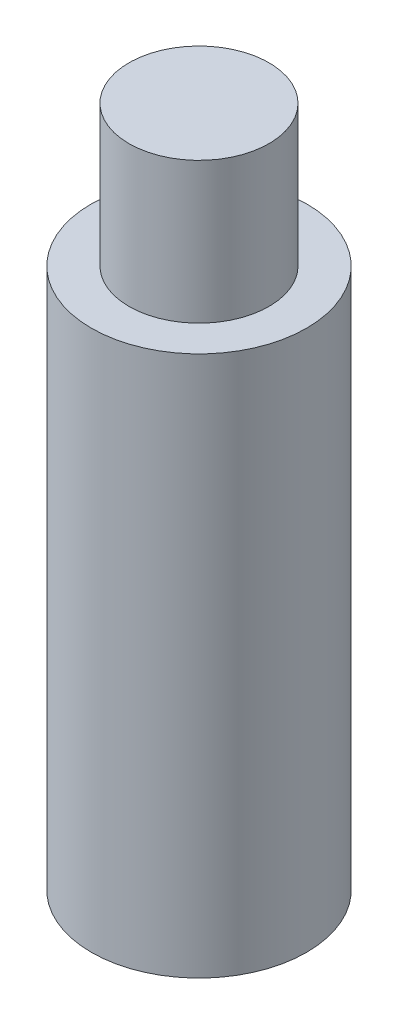
ISO-10303-21;
HEADER;
FILE_DESCRIPTION(('STEP AP214'),'2;1');
FILE_NAME('part.step','',(''),(''),'','','');
FILE_SCHEMA(('AUTOMOTIVE_DESIGN { 1 0 10303 214 1 1 1 1 }'));
ENDSEC;
DATA;
#1=APPLICATION_CONTEXT('core data for automotive mechanical design processes');
#2=APPLICATION_PROTOCOL_DEFINITION('international standard','automotive_design',2000,#1);
#3=PRODUCT_CONTEXT('',#1,'mechanical');
#4=PRODUCT('Part','Part','',(#3));
#5=PRODUCT_RELATED_PRODUCT_CATEGORY('part','',(#4));
#6=PRODUCT_DEFINITION_FORMATION('','',#4);
#7=PRODUCT_DEFINITION_CONTEXT('part definition',#1,'design');
#8=PRODUCT_DEFINITION('design','',#6,#7);
#9=PRODUCT_DEFINITION_SHAPE('','',#8);
#10=(LENGTH_UNIT() NAMED_UNIT(*) SI_UNIT(.MILLI.,.METRE.));
#11=(NAMED_UNIT(*) PLANE_ANGLE_UNIT() SI_UNIT($,.RADIAN.));
#12=(NAMED_UNIT(*) SI_UNIT($,.STERADIAN.) SOLID_ANGLE_UNIT());
#13=UNCERTAINTY_MEASURE_WITH_UNIT(LENGTH_MEASURE(1.E-05),#10,'distance_accuracy_value','');
#14=(GEOMETRIC_REPRESENTATION_CONTEXT(3) GLOBAL_UNCERTAINTY_ASSIGNED_CONTEXT((#13)) GLOBAL_UNIT_ASSIGNED_CONTEXT((#10,
#11,#12)) REPRESENTATION_CONTEXT('',''));
#15=CARTESIAN_POINT('',(0.,0.,0.));
#16=DIRECTION('',(0.,0.,1.));
#17=DIRECTION('',(1.,0.,0.));
#18=AXIS2_PLACEMENT_3D('',#15,#16,#17);
#19=CARTESIAN_POINT('',(0.,0.,0.));
#20=DIRECTION('',(0.,1.,0.));
#21=DIRECTION('',(0.,0.,1.));
#22=AXIS2_PLACEMENT_3D('',#19,#20,#21);
#23=PLANE('',#22);
#24=CARTESIAN_POINT('',(0.,0.,0.));
#25=DIRECTION('',(0.,1.,0.));
#26=DIRECTION('',(0.,0.,1.));
#27=AXIS2_PLACEMENT_3D('',#24,#25,#26);
#28=CIRCLE('',#27,11.45);
#29=CARTESIAN_POINT('',(0.,0.,11.45));
#30=VERTEX_POINT('',#29);
#31=EDGE_CURVE('E44',#30,#30,#28,.T.);
#32=ORIENTED_EDGE('',*,*,#31,.F.);
#33=EDGE_LOOP('',(#32));
#34=FACE_BOUND('',#33,.T.);
#35=DIRECTION('',(0.949325468520331,0.,0.314294694226064));
#36=VECTOR('',#35,1.);
#37=CARTESIAN_POINT('',(-0.963941109857239,0.,2.91157904524799));
#38=LINE('',#37,#36);
#39=CARTESIAN_POINT('',(-3.47490697409351,0.,2.08026957902005));
#40=VERTEX_POINT('',#39);
#41=CARTESIAN_POINT('',(1.54702475437904,0.,3.74288851147593));
#42=VERTEX_POINT('',#41);
#43=EDGE_CURVE('E57',#40,#42,#38,.T.);
#44=ORIENTED_EDGE('',*,*,#43,.T.);
#45=CARTESIAN_POINT('',(0.,0.,0.));
#46=DIRECTION('',(0.,-1.,0.));
#47=DIRECTION('',(0.,0.,-1.));
#48=AXIS2_PLACEMENT_3D('',#45,#46,#47);
#49=CIRCLE('',#48,4.05);
#50=EDGE_CURVE('E77',#40,#42,#49,.T.);
#51=ORIENTED_EDGE('',*,*,#50,.F.);
#52=EDGE_LOOP('',(#44,#51));
#53=FACE_BOUND('',#52,.T.);
#54=ADVANCED_FACE('F40',(#34,#53),#23,.F.);
#55=CARTESIAN_POINT('',(0.,57.5,0.));
#56=DIRECTION('',(0.,-1.,0.));
#57=DIRECTION('',(0.,0.,-1.));
#58=AXIS2_PLACEMENT_3D('',#55,#56,#57);
#59=CYLINDRICAL_SURFACE('',#58,11.45);
#60=CARTESIAN_POINT('',(0.,57.5,0.));
#61=DIRECTION('',(0.,1.,0.));
#62=DIRECTION('',(0.,0.,1.));
#63=AXIS2_PLACEMENT_3D('',#60,#61,#62);
#64=CIRCLE('',#63,11.45);
#65=CARTESIAN_POINT('',(0.,57.5,11.45));
#66=VERTEX_POINT('',#65);
#67=EDGE_CURVE('E49',#66,#66,#64,.T.);
#68=ORIENTED_EDGE('',*,*,#67,.F.);
#69=EDGE_LOOP('',(#68));
#70=FACE_BOUND('',#69,.T.);
#71=ORIENTED_EDGE('',*,*,#31,.T.);
#72=EDGE_LOOP('',(#71));
#73=FACE_BOUND('',#72,.T.);
#74=ADVANCED_FACE('F42',(#70,#73),#59,.T.);
#75=CARTESIAN_POINT('',(0.,57.5,0.));
#76=DIRECTION('',(0.,1.,0.));
#77=DIRECTION('',(0.,0.,1.));
#78=AXIS2_PLACEMENT_3D('',#75,#76,#77);
#79=PLANE('',#78);
#80=CARTESIAN_POINT('',(0.,57.5,0.));
#81=DIRECTION('',(0.,1.,0.));
#82=DIRECTION('',(0.,0.,1.));
#83=AXIS2_PLACEMENT_3D('',#80,#81,#82);
#84=CIRCLE('',#83,7.45);
#85=CARTESIAN_POINT('',(0.,57.5,7.45));
#86=VERTEX_POINT('',#85);
#87=EDGE_CURVE('E11',#86,#86,#84,.T.);
#88=ORIENTED_EDGE('',*,*,#87,.F.);
#89=EDGE_LOOP('',(#88));
#90=FACE_BOUND('',#89,.T.);
#91=ORIENTED_EDGE('',*,*,#67,.T.);
#92=EDGE_LOOP('',(#91));
#93=FACE_BOUND('',#92,.T.);
#94=ADVANCED_FACE('F101',(#90,#93),#79,.T.);
#95=CARTESIAN_POINT('',(0.,72.5,0.));
#96=DIRECTION('',(0.,-1.,0.));
#97=DIRECTION('',(0.,0.,-1.));
#98=AXIS2_PLACEMENT_3D('',#95,#96,#97);
#99=CYLINDRICAL_SURFACE('',#98,7.45);
#100=CARTESIAN_POINT('',(0.,72.5,0.));
#101=DIRECTION('',(0.,1.,0.));
#102=DIRECTION('',(0.,0.,1.));
#103=AXIS2_PLACEMENT_3D('',#100,#101,#102);
#104=CIRCLE('',#103,7.45);
#105=CARTESIAN_POINT('',(0.,72.5,7.45));
#106=VERTEX_POINT('',#105);
#107=EDGE_CURVE('E73',#106,#106,#104,.T.);
#108=ORIENTED_EDGE('',*,*,#107,.F.);
#109=EDGE_LOOP('',(#108));
#110=FACE_BOUND('',#109,.T.);
#111=ORIENTED_EDGE('',*,*,#87,.T.);
#112=EDGE_LOOP('',(#111));
#113=FACE_BOUND('',#112,.T.);
#114=ADVANCED_FACE('F106',(#110,#113),#99,.T.);
#115=CARTESIAN_POINT('',(0.,72.5,0.));
#116=DIRECTION('',(0.,1.,0.));
#117=DIRECTION('',(0.,0.,1.));
#118=AXIS2_PLACEMENT_3D('',#115,#116,#117);
#119=PLANE('',#118);
#120=ORIENTED_EDGE('',*,*,#107,.T.);
#121=EDGE_LOOP('',(#120));
#122=FACE_BOUND('',#121,.T.);
#123=ADVANCED_FACE('F110',(#122),#119,.T.);
#124=CARTESIAN_POINT('',(-0.963941109857239,15.,2.91157904524799));
#125=DIRECTION('',(0.314294694226064,0.,-0.949325468520331));
#126=DIRECTION('',(-0.949325468520331,0.,-0.314294694226064));
#127=AXIS2_PLACEMENT_3D('',#124,#125,#126);
#128=PLANE('',#127);
#129=ORIENTED_EDGE('',*,*,#43,.F.);
#130=DIRECTION('',(0.,-1.,0.));
#131=VECTOR('',#130,1.);
#132=CARTESIAN_POINT('',(-3.47490697409351,15.,2.08026957902005));
#133=LINE('',#132,#131);
#134=CARTESIAN_POINT('',(-3.47490697409351,15.,2.08026957902005));
#135=VERTEX_POINT('',#134);
#136=EDGE_CURVE('E74',#135,#40,#133,.T.);
#137=ORIENTED_EDGE('',*,*,#136,.F.);
#138=DIRECTION('',(0.949325468520331,0.,0.314294694226064));
#139=VECTOR('',#138,1.);
#140=CARTESIAN_POINT('',(-0.963941109857239,15.,2.91157904524799));
#141=LINE('',#140,#139);
#142=CARTESIAN_POINT('',(1.54702475437904,15.,3.74288851147593));
#143=VERTEX_POINT('',#142);
#144=EDGE_CURVE('E63',#135,#143,#141,.T.);
#145=ORIENTED_EDGE('',*,*,#144,.T.);
#146=DIRECTION('',(0.,-1.,0.));
#147=VECTOR('',#146,1.);
#148=CARTESIAN_POINT('',(1.54702475437904,15.,3.74288851147593));
#149=LINE('',#148,#147);
#150=EDGE_CURVE('E67',#143,#42,#149,.T.);
#151=ORIENTED_EDGE('',*,*,#150,.T.);
#152=EDGE_LOOP('',(#129,#137,#145,#151));
#153=FACE_BOUND('',#152,.T.);
#154=ADVANCED_FACE('F69',(#153),#128,.T.);
#155=CARTESIAN_POINT('',(0.,15.,0.));
#156=DIRECTION('',(0.,-1.,0.));
#157=DIRECTION('',(0.,0.,-1.));
#158=AXIS2_PLACEMENT_3D('',#155,#156,#157);
#159=CYLINDRICAL_SURFACE('',#158,4.05);
#160=ORIENTED_EDGE('',*,*,#50,.T.);
#161=ORIENTED_EDGE('',*,*,#150,.F.);
#162=CARTESIAN_POINT('',(0.,15.,0.));
#163=DIRECTION('',(0.,-1.,0.));
#164=DIRECTION('',(0.,0.,-1.));
#165=AXIS2_PLACEMENT_3D('',#162,#163,#164);
#166=CIRCLE('',#165,4.05);
#167=EDGE_CURVE('E83',#135,#143,#166,.T.);
#168=ORIENTED_EDGE('',*,*,#167,.F.);
#169=ORIENTED_EDGE('',*,*,#136,.T.);
#170=EDGE_LOOP('',(#160,#161,#168,#169));
#171=FACE_BOUND('',#170,.T.);
#172=ADVANCED_FACE('F78',(#171),#159,.F.);
#173=CARTESIAN_POINT('',(0.,15.,0.));
#174=DIRECTION('',(0.,-1.,0.));
#175=DIRECTION('',(0.,0.,-1.));
#176=AXIS2_PLACEMENT_3D('',#173,#174,#175);
#177=PLANE('',#176);
#178=ORIENTED_EDGE('',*,*,#144,.F.);
#179=ORIENTED_EDGE('',*,*,#167,.T.);
#180=EDGE_LOOP('',(#178,#179));
#181=FACE_BOUND('',#180,.T.);
#182=ADVANCED_FACE('F119',(#181),#177,.T.);
#183=CLOSED_SHELL('',(#54,#74,#94,#114,#123,#154,#172,#182));
#184=MANIFOLD_SOLID_BREP('B2',#183);
#185=ADVANCED_BREP_SHAPE_REPRESENTATION('',(#18,#184),#14);
#186=SHAPE_DEFINITION_REPRESENTATION(#9,#185);
ENDSEC;
END-ISO-10303-21;
